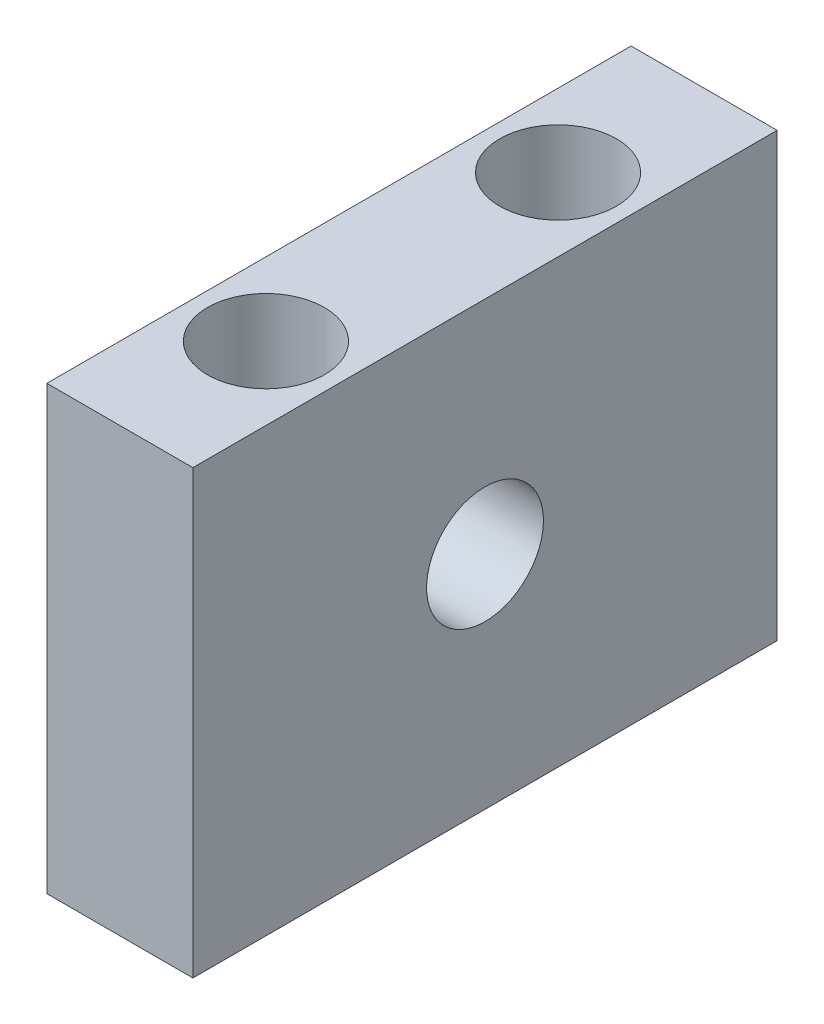
ISO-10303-21;
HEADER;
FILE_DESCRIPTION(('STEP AP214'),'2;1');
FILE_NAME('part.step','',(''),(''),'','','');
FILE_SCHEMA(('AUTOMOTIVE_DESIGN { 1 0 10303 214 1 1 1 1 }'));
ENDSEC;
DATA;
#1=APPLICATION_CONTEXT('core data for automotive mechanical design processes');
#2=APPLICATION_PROTOCOL_DEFINITION('international standard','automotive_design',2000,#1);
#3=PRODUCT_CONTEXT('',#1,'mechanical');
#4=PRODUCT('Part','Part','',(#3));
#5=PRODUCT_RELATED_PRODUCT_CATEGORY('part','',(#4));
#6=PRODUCT_DEFINITION_FORMATION('','',#4);
#7=PRODUCT_DEFINITION_CONTEXT('part definition',#1,'design');
#8=PRODUCT_DEFINITION('design','',#6,#7);
#9=PRODUCT_DEFINITION_SHAPE('','',#8);
#10=(LENGTH_UNIT() NAMED_UNIT(*) SI_UNIT(.MILLI.,.METRE.));
#11=(NAMED_UNIT(*) PLANE_ANGLE_UNIT() SI_UNIT($,.RADIAN.));
#12=(NAMED_UNIT(*) SI_UNIT($,.STERADIAN.) SOLID_ANGLE_UNIT());
#13=UNCERTAINTY_MEASURE_WITH_UNIT(LENGTH_MEASURE(1.E-05),#10,'distance_accuracy_value','');
#14=(GEOMETRIC_REPRESENTATION_CONTEXT(3) GLOBAL_UNCERTAINTY_ASSIGNED_CONTEXT((#13)) GLOBAL_UNIT_ASSIGNED_CONTEXT((#10,
#11,#12)) REPRESENTATION_CONTEXT('',''));
#15=CARTESIAN_POINT('',(0.,0.,0.));
#16=DIRECTION('',(0.,0.,1.));
#17=DIRECTION('',(1.,0.,0.));
#18=AXIS2_PLACEMENT_3D('',#15,#16,#17);
#19=CARTESIAN_POINT('',(5.,30.26,-20.));
#20=DIRECTION('',(-1.,0.,0.));
#21=DIRECTION('',(0.,0.,1.));
#22=AXIS2_PLACEMENT_3D('',#19,#20,#21);
#23=PLANE('',#22);
#24=CARTESIAN_POINT('',(5.,15.13,0.));
#25=DIRECTION('',(-1.,0.,0.));
#26=DIRECTION('',(0.,0.,1.));
#27=AXIS2_PLACEMENT_3D('',#24,#25,#26);
#28=CIRCLE('',#27,4.);
#29=CARTESIAN_POINT('',(5.,15.13,-4.));
#30=VERTEX_POINT('',#29);
#31=EDGE_CURVE('E135',#30,#30,#28,.T.);
#32=ORIENTED_EDGE('',*,*,#31,.T.);
#33=EDGE_LOOP('',(#32));
#34=FACE_BOUND('',#33,.T.);
#35=DIRECTION('',(0.,0.,-1.));
#36=VECTOR('',#35,1.);
#37=CARTESIAN_POINT('',(5.,0.,-20.));
#38=LINE('',#37,#36);
#39=CARTESIAN_POINT('',(5.,0.,20.));
#40=VERTEX_POINT('',#39);
#41=CARTESIAN_POINT('',(5.,0.,-20.));
#42=VERTEX_POINT('',#41);
#43=EDGE_CURVE('E109',#40,#42,#38,.T.);
#44=ORIENTED_EDGE('',*,*,#43,.T.);
#45=DIRECTION('',(0.,-1.,0.));
#46=VECTOR('',#45,1.);
#47=CARTESIAN_POINT('',(5.,30.26,-20.));
#48=LINE('',#47,#46);
#49=CARTESIAN_POINT('',(5.,30.26,-20.));
#50=VERTEX_POINT('',#49);
#51=EDGE_CURVE('E11',#50,#42,#48,.T.);
#52=ORIENTED_EDGE('',*,*,#51,.F.);
#53=DIRECTION('',(0.,0.,-1.));
#54=VECTOR('',#53,1.);
#55=CARTESIAN_POINT('',(5.,30.26,-20.));
#56=LINE('',#55,#54);
#57=CARTESIAN_POINT('',(5.,30.26,20.));
#58=VERTEX_POINT('',#57);
#59=EDGE_CURVE('E92',#58,#50,#56,.T.);
#60=ORIENTED_EDGE('',*,*,#59,.F.);
#61=DIRECTION('',(0.,-1.,0.));
#62=VECTOR('',#61,1.);
#63=CARTESIAN_POINT('',(5.,30.26,20.));
#64=LINE('',#63,#62);
#65=EDGE_CURVE('E105',#58,#40,#64,.T.);
#66=ORIENTED_EDGE('',*,*,#65,.T.);
#67=EDGE_LOOP('',(#44,#52,#60,#66));
#68=FACE_BOUND('',#67,.T.);
#69=ADVANCED_FACE('F39',(#34,#68),#23,.F.);
#70=CARTESIAN_POINT('',(-5.,30.26,-20.));
#71=DIRECTION('',(0.,0.,1.));
#72=DIRECTION('',(1.,0.,0.));
#73=AXIS2_PLACEMENT_3D('',#70,#71,#72);
#74=PLANE('',#73);
#75=DIRECTION('',(-1.,0.,0.));
#76=VECTOR('',#75,1.);
#77=CARTESIAN_POINT('',(-5.,0.,-20.));
#78=LINE('',#77,#76);
#79=CARTESIAN_POINT('',(-5.,0.,-20.));
#80=VERTEX_POINT('',#79);
#81=EDGE_CURVE('E97',#42,#80,#78,.T.);
#82=ORIENTED_EDGE('',*,*,#81,.T.);
#83=DIRECTION('',(0.,-1.,0.));
#84=VECTOR('',#83,1.);
#85=CARTESIAN_POINT('',(-5.,30.26,-20.));
#86=LINE('',#85,#84);
#87=CARTESIAN_POINT('',(-5.,30.26,-20.));
#88=VERTEX_POINT('',#87);
#89=EDGE_CURVE('E49',#88,#80,#86,.T.);
#90=ORIENTED_EDGE('',*,*,#89,.F.);
#91=DIRECTION('',(-1.,0.,0.));
#92=VECTOR('',#91,1.);
#93=CARTESIAN_POINT('',(-5.,30.26,-20.));
#94=LINE('',#93,#92);
#95=EDGE_CURVE('E87',#50,#88,#94,.T.);
#96=ORIENTED_EDGE('',*,*,#95,.F.);
#97=ORIENTED_EDGE('',*,*,#51,.T.);
#98=EDGE_LOOP('',(#82,#90,#96,#97));
#99=FACE_BOUND('',#98,.T.);
#100=ADVANCED_FACE('F96',(#99),#74,.F.);
#101=CARTESIAN_POINT('',(-5.,30.26,-20.));
#102=DIRECTION('',(1.,0.,0.));
#103=DIRECTION('',(0.,0.,-1.));
#104=AXIS2_PLACEMENT_3D('',#101,#102,#103);
#105=PLANE('',#104);
#106=CARTESIAN_POINT('',(-5.,15.13,0.));
#107=DIRECTION('',(1.,0.,0.));
#108=DIRECTION('',(0.,0.,-1.));
#109=AXIS2_PLACEMENT_3D('',#106,#107,#108);
#110=CIRCLE('',#109,4.);
#111=CARTESIAN_POINT('',(-5.,15.13,-4.));
#112=VERTEX_POINT('',#111);
#113=EDGE_CURVE('E42',#112,#112,#110,.T.);
#114=ORIENTED_EDGE('',*,*,#113,.T.);
#115=EDGE_LOOP('',(#114));
#116=FACE_BOUND('',#115,.T.);
#117=DIRECTION('',(0.,0.,1.));
#118=VECTOR('',#117,1.);
#119=CARTESIAN_POINT('',(-5.,0.,-20.));
#120=LINE('',#119,#118);
#121=CARTESIAN_POINT('',(-5.,0.,20.));
#122=VERTEX_POINT('',#121);
#123=EDGE_CURVE('E74',#80,#122,#120,.T.);
#124=ORIENTED_EDGE('',*,*,#123,.T.);
#125=DIRECTION('',(0.,-1.,0.));
#126=VECTOR('',#125,1.);
#127=CARTESIAN_POINT('',(-5.,30.26,20.));
#128=LINE('',#127,#126);
#129=CARTESIAN_POINT('',(-5.,30.26,20.));
#130=VERTEX_POINT('',#129);
#131=EDGE_CURVE('E99',#130,#122,#128,.T.);
#132=ORIENTED_EDGE('',*,*,#131,.F.);
#133=DIRECTION('',(0.,0.,1.));
#134=VECTOR('',#133,1.);
#135=CARTESIAN_POINT('',(-5.,30.26,-20.));
#136=LINE('',#135,#134);
#137=EDGE_CURVE('E90',#88,#130,#136,.T.);
#138=ORIENTED_EDGE('',*,*,#137,.F.);
#139=ORIENTED_EDGE('',*,*,#89,.T.);
#140=EDGE_LOOP('',(#124,#132,#138,#139));
#141=FACE_BOUND('',#140,.T.);
#142=ADVANCED_FACE('F101',(#116,#141),#105,.F.);
#143=CARTESIAN_POINT('',(-5.,30.26,20.));
#144=DIRECTION('',(0.,0.,-1.));
#145=DIRECTION('',(-1.,0.,0.));
#146=AXIS2_PLACEMENT_3D('',#143,#144,#145);
#147=PLANE('',#146);
#148=DIRECTION('',(1.,0.,0.));
#149=VECTOR('',#148,1.);
#150=CARTESIAN_POINT('',(-5.,0.,20.));
#151=LINE('',#150,#149);
#152=EDGE_CURVE('E80',#122,#40,#151,.T.);
#153=ORIENTED_EDGE('',*,*,#152,.T.);
#154=ORIENTED_EDGE('',*,*,#65,.F.);
#155=DIRECTION('',(1.,0.,0.));
#156=VECTOR('',#155,1.);
#157=CARTESIAN_POINT('',(-5.,30.26,20.));
#158=LINE('',#157,#156);
#159=EDGE_CURVE('E57',#130,#58,#158,.T.);
#160=ORIENTED_EDGE('',*,*,#159,.F.);
#161=ORIENTED_EDGE('',*,*,#131,.T.);
#162=EDGE_LOOP('',(#153,#154,#160,#161));
#163=FACE_BOUND('',#162,.T.);
#164=ADVANCED_FACE('F123',(#163),#147,.F.);
#165=CARTESIAN_POINT('',(0.,30.26,0.));
#166=DIRECTION('',(0.,1.,0.));
#167=DIRECTION('',(0.,0.,1.));
#168=AXIS2_PLACEMENT_3D('',#165,#166,#167);
#169=PLANE('',#168);
#170=CARTESIAN_POINT('',(0.,30.26,10.));
#171=DIRECTION('',(0.,1.,0.));
#172=DIRECTION('',(0.,0.,1.));
#173=AXIS2_PLACEMENT_3D('',#170,#171,#172);
#174=CIRCLE('',#173,4.);
#175=CARTESIAN_POINT('',(0.,30.26,6.));
#176=VERTEX_POINT('',#175);
#177=EDGE_CURVE('E113',#176,#176,#174,.T.);
#178=ORIENTED_EDGE('',*,*,#177,.F.);
#179=EDGE_LOOP('',(#178));
#180=FACE_BOUND('',#179,.T.);
#181=CARTESIAN_POINT('',(0.,30.26,-10.));
#182=DIRECTION('',(0.,1.,0.));
#183=DIRECTION('',(0.,0.,1.));
#184=AXIS2_PLACEMENT_3D('',#181,#182,#183);
#185=CIRCLE('',#184,4.);
#186=CARTESIAN_POINT('',(0.,30.26,-14.));
#187=VERTEX_POINT('',#186);
#188=EDGE_CURVE('E134',#187,#187,#185,.T.);
#189=ORIENTED_EDGE('',*,*,#188,.F.);
#190=EDGE_LOOP('',(#189));
#191=FACE_BOUND('',#190,.T.);
#192=ORIENTED_EDGE('',*,*,#59,.T.);
#193=ORIENTED_EDGE('',*,*,#95,.T.);
#194=ORIENTED_EDGE('',*,*,#137,.T.);
#195=ORIENTED_EDGE('',*,*,#159,.T.);
#196=EDGE_LOOP('',(#192,#193,#194,#195));
#197=FACE_BOUND('',#196,.T.);
#198=ADVANCED_FACE('F88',(#180,#191,#197),#169,.T.);
#199=CARTESIAN_POINT('',(0.,0.,0.));
#200=DIRECTION('',(0.,1.,0.));
#201=DIRECTION('',(0.,0.,1.));
#202=AXIS2_PLACEMENT_3D('',#199,#200,#201);
#203=PLANE('',#202);
#204=CARTESIAN_POINT('',(0.,0.,10.));
#205=DIRECTION('',(0.,1.,0.));
#206=DIRECTION('',(0.,0.,1.));
#207=AXIS2_PLACEMENT_3D('',#204,#205,#206);
#208=CIRCLE('',#207,4.);
#209=CARTESIAN_POINT('',(0.,0.,6.));
#210=VERTEX_POINT('',#209);
#211=EDGE_CURVE('E139',#210,#210,#208,.T.);
#212=ORIENTED_EDGE('',*,*,#211,.T.);
#213=EDGE_LOOP('',(#212));
#214=FACE_BOUND('',#213,.T.);
#215=CARTESIAN_POINT('',(0.,0.,-10.));
#216=DIRECTION('',(0.,1.,0.));
#217=DIRECTION('',(0.,0.,1.));
#218=AXIS2_PLACEMENT_3D('',#215,#216,#217);
#219=CIRCLE('',#218,4.);
#220=CARTESIAN_POINT('',(0.,0.,-14.));
#221=VERTEX_POINT('',#220);
#222=EDGE_CURVE('E130',#221,#221,#219,.T.);
#223=ORIENTED_EDGE('',*,*,#222,.T.);
#224=EDGE_LOOP('',(#223));
#225=FACE_BOUND('',#224,.T.);
#226=ORIENTED_EDGE('',*,*,#43,.F.);
#227=ORIENTED_EDGE('',*,*,#152,.F.);
#228=ORIENTED_EDGE('',*,*,#123,.F.);
#229=ORIENTED_EDGE('',*,*,#81,.F.);
#230=EDGE_LOOP('',(#226,#227,#228,#229));
#231=FACE_BOUND('',#230,.T.);
#232=ADVANCED_FACE('F126',(#214,#225,#231),#203,.F.);
#233=CARTESIAN_POINT('',(0.,30.26,-10.));
#234=DIRECTION('',(0.,-1.,0.));
#235=DIRECTION('',(0.,0.,-1.));
#236=AXIS2_PLACEMENT_3D('',#233,#234,#235);
#237=CYLINDRICAL_SURFACE('',#236,4.);
#238=CARTESIAN_POINT('',(0.,30.26,-14.));
#239=CARTESIAN_POINT('',(0.,29.9447916666667,-14.));
#240=CARTESIAN_POINT('',(0.,29.6295833333333,-14.));
#241=CARTESIAN_POINT('',(0.,28.9991666666667,-14.));
#242=CARTESIAN_POINT('',(0.,28.6839583333333,-14.));
#243=CARTESIAN_POINT('',(0.,28.0535416666667,-14.));
#244=CARTESIAN_POINT('',(0.,27.7383333333333,-14.));
#245=CARTESIAN_POINT('',(0.,27.1079166666667,-14.));
#246=CARTESIAN_POINT('',(0.,26.7927083333333,-14.));
#247=CARTESIAN_POINT('',(0.,26.1622916666667,-14.));
#248=CARTESIAN_POINT('',(0.,25.8470833333333,-14.));
#249=CARTESIAN_POINT('',(0.,25.2166666666667,-14.));
#250=CARTESIAN_POINT('',(0.,24.9014583333333,-14.));
#251=CARTESIAN_POINT('',(0.,24.2710416666667,-14.));
#252=CARTESIAN_POINT('',(0.,23.9558333333333,-14.));
#253=CARTESIAN_POINT('',(0.,23.3254166666667,-14.));
#254=CARTESIAN_POINT('',(0.,23.0102083333333,-14.));
#255=CARTESIAN_POINT('',(0.,22.3797916666667,-14.));
#256=CARTESIAN_POINT('',(0.,22.0645833333333,-14.));
#257=CARTESIAN_POINT('',(0.,21.4341666666667,-14.));
#258=CARTESIAN_POINT('',(0.,21.1189583333333,-14.));
#259=CARTESIAN_POINT('',(0.,20.4885416666667,-14.));
#260=CARTESIAN_POINT('',(0.,20.1733333333333,-14.));
#261=CARTESIAN_POINT('',(0.,19.5429166666667,-14.));
#262=CARTESIAN_POINT('',(0.,19.2277083333333,-14.));
#263=CARTESIAN_POINT('',(0.,18.5972916666667,-14.));
#264=CARTESIAN_POINT('',(0.,18.2820833333333,-14.));
#265=CARTESIAN_POINT('',(0.,17.6516666666667,-14.));
#266=CARTESIAN_POINT('',(0.,17.3364583333333,-14.));
#267=CARTESIAN_POINT('',(0.,16.7060416666667,-14.));
#268=CARTESIAN_POINT('',(0.,16.3908333333333,-14.));
#269=CARTESIAN_POINT('',(0.,15.7604166666667,-14.));
#270=CARTESIAN_POINT('',(0.,15.4452083333333,-14.));
#271=CARTESIAN_POINT('',(0.,14.8147916666667,-14.));
#272=CARTESIAN_POINT('',(0.,14.4995833333333,-14.));
#273=CARTESIAN_POINT('',(0.,13.8691666666667,-14.));
#274=CARTESIAN_POINT('',(0.,13.5539583333333,-14.));
#275=CARTESIAN_POINT('',(0.,12.9235416666667,-14.));
#276=CARTESIAN_POINT('',(0.,12.6083333333333,-14.));
#277=CARTESIAN_POINT('',(0.,11.9779166666667,-14.));
#278=CARTESIAN_POINT('',(0.,11.6627083333333,-14.));
#279=CARTESIAN_POINT('',(0.,11.0322916666667,-14.));
#280=CARTESIAN_POINT('',(0.,10.7170833333333,-14.));
#281=CARTESIAN_POINT('',(0.,10.0866666666667,-14.));
#282=CARTESIAN_POINT('',(0.,9.77145833333333,-14.));
#283=CARTESIAN_POINT('',(0.,9.14104166666666,-14.));
#284=CARTESIAN_POINT('',(0.,8.82583333333333,-14.));
#285=CARTESIAN_POINT('',(0.,8.19541666666666,-14.));
#286=CARTESIAN_POINT('',(0.,7.88020833333333,-14.));
#287=CARTESIAN_POINT('',(0.,7.24979166666667,-14.));
#288=CARTESIAN_POINT('',(0.,6.93458333333333,-14.));
#289=CARTESIAN_POINT('',(0.,6.30416666666666,-14.));
#290=CARTESIAN_POINT('',(0.,5.98895833333333,-14.));
#291=CARTESIAN_POINT('',(0.,5.35854166666666,-14.));
#292=CARTESIAN_POINT('',(0.,5.04333333333333,-14.));
#293=CARTESIAN_POINT('',(0.,4.41291666666666,-14.));
#294=CARTESIAN_POINT('',(0.,4.09770833333333,-14.));
#295=CARTESIAN_POINT('',(0.,3.46729166666666,-14.));
#296=CARTESIAN_POINT('',(0.,3.15208333333333,-14.));
#297=CARTESIAN_POINT('',(0.,2.52166666666666,-14.));
#298=CARTESIAN_POINT('',(0.,2.20645833333333,-14.));
#299=CARTESIAN_POINT('',(0.,1.57604166666666,-14.));
#300=CARTESIAN_POINT('',(0.,1.26083333333333,-14.));
#301=CARTESIAN_POINT('',(0.,0.630416666666662,-14.));
#302=CARTESIAN_POINT('',(0.,0.315208333333329,-14.));
#303=CARTESIAN_POINT('',(0.,0.,-14.));
#304=B_SPLINE_CURVE_WITH_KNOTS('',3,(#238,#239,#240,#241,#242,#243,#244,#245,#246,#247,#248,
#249,#250,#251,#252,#253,#254,#255,#256,#257,#258,#259,#260,#261,#262,#263,#264,#265,#266,#267,
#268,#269,#270,#271,#272,#273,#274,#275,#276,#277,#278,#279,#280,#281,#282,#283,#284,#285,#286,
#287,#288,#289,#290,#291,#292,#293,#294,#295,#296,#297,#298,#299,#300,#301,#302,#303),
.UNSPECIFIED.,.F.,.F.,(4,2,2,2,2,2,2,2,2,2,2,2,2,2,2,2,2,2,2,2,2,2,2,2,2,2,2,2,2,2,2,2,4),(0.,
0.945624999999999,1.89125,2.836875,3.7825,4.728125,5.67375,6.619375,7.565,8.510625,9.45625,
10.401875,11.3475,12.293125,13.23875,14.184375,15.13,16.075625,17.02125,17.966875,18.9125,
19.858125,20.80375,21.749375,22.695,23.640625,24.58625,25.531875,26.4775,27.423125,28.36875,
29.314375,30.26),.UNSPECIFIED.);
#305=EDGE_CURVE('BSEAM163',#187,#221,#304,.T.);
#306=ORIENTED_EDGE('',*,*,#188,.T.);
#307=ORIENTED_EDGE('',*,*,#222,.F.);
#308=ORIENTED_EDGE('',*,*,#305,.T.);
#309=ORIENTED_EDGE('',*,*,#305,.F.);
#310=EDGE_LOOP('',(#306,#308,#307,#309));
#311=FACE_BOUND('',#310,.T.);
#312=ADVANCED_FACE('F163',(#311),#237,.F.);
#313=CARTESIAN_POINT('',(0.,30.26,10.));
#314=DIRECTION('',(0.,-1.,0.));
#315=DIRECTION('',(0.,0.,-1.));
#316=AXIS2_PLACEMENT_3D('',#313,#314,#315);
#317=CYLINDRICAL_SURFACE('',#316,4.);
#318=CARTESIAN_POINT('',(0.,30.26,6.));
#319=CARTESIAN_POINT('',(0.,29.9447916666667,6.));
#320=CARTESIAN_POINT('',(0.,29.6295833333333,6.));
#321=CARTESIAN_POINT('',(0.,28.9991666666667,6.));
#322=CARTESIAN_POINT('',(0.,28.6839583333333,6.));
#323=CARTESIAN_POINT('',(0.,28.0535416666667,6.));
#324=CARTESIAN_POINT('',(0.,27.7383333333333,6.));
#325=CARTESIAN_POINT('',(0.,27.1079166666667,6.));
#326=CARTESIAN_POINT('',(0.,26.7927083333333,6.));
#327=CARTESIAN_POINT('',(0.,26.1622916666667,6.));
#328=CARTESIAN_POINT('',(0.,25.8470833333333,6.));
#329=CARTESIAN_POINT('',(0.,25.2166666666667,6.));
#330=CARTESIAN_POINT('',(0.,24.9014583333333,6.));
#331=CARTESIAN_POINT('',(0.,24.2710416666667,6.));
#332=CARTESIAN_POINT('',(0.,23.9558333333333,6.));
#333=CARTESIAN_POINT('',(0.,23.3254166666667,6.));
#334=CARTESIAN_POINT('',(0.,23.0102083333333,6.));
#335=CARTESIAN_POINT('',(0.,22.3797916666667,6.));
#336=CARTESIAN_POINT('',(0.,22.0645833333333,6.));
#337=CARTESIAN_POINT('',(0.,21.4341666666667,6.));
#338=CARTESIAN_POINT('',(0.,21.1189583333333,6.));
#339=CARTESIAN_POINT('',(0.,20.4885416666667,6.));
#340=CARTESIAN_POINT('',(0.,20.1733333333333,6.));
#341=CARTESIAN_POINT('',(0.,19.5429166666667,6.));
#342=CARTESIAN_POINT('',(0.,19.2277083333333,6.));
#343=CARTESIAN_POINT('',(0.,18.5972916666667,6.));
#344=CARTESIAN_POINT('',(0.,18.2820833333333,6.));
#345=CARTESIAN_POINT('',(0.,17.6516666666667,6.));
#346=CARTESIAN_POINT('',(0.,17.3364583333333,6.));
#347=CARTESIAN_POINT('',(0.,16.7060416666667,6.));
#348=CARTESIAN_POINT('',(0.,16.3908333333333,6.));
#349=CARTESIAN_POINT('',(0.,15.7604166666667,6.));
#350=CARTESIAN_POINT('',(0.,15.4452083333333,6.));
#351=CARTESIAN_POINT('',(0.,14.8147916666667,6.));
#352=CARTESIAN_POINT('',(0.,14.4995833333333,6.));
#353=CARTESIAN_POINT('',(0.,13.8691666666667,6.));
#354=CARTESIAN_POINT('',(0.,13.5539583333333,6.));
#355=CARTESIAN_POINT('',(0.,12.9235416666667,6.));
#356=CARTESIAN_POINT('',(0.,12.6083333333333,6.));
#357=CARTESIAN_POINT('',(0.,11.9779166666667,6.));
#358=CARTESIAN_POINT('',(0.,11.6627083333333,6.));
#359=CARTESIAN_POINT('',(0.,11.0322916666667,6.));
#360=CARTESIAN_POINT('',(0.,10.7170833333333,6.));
#361=CARTESIAN_POINT('',(0.,10.0866666666667,6.));
#362=CARTESIAN_POINT('',(0.,9.77145833333333,6.));
#363=CARTESIAN_POINT('',(0.,9.14104166666666,6.));
#364=CARTESIAN_POINT('',(0.,8.82583333333333,6.));
#365=CARTESIAN_POINT('',(0.,8.19541666666666,6.));
#366=CARTESIAN_POINT('',(0.,7.88020833333333,6.));
#367=CARTESIAN_POINT('',(0.,7.24979166666667,6.));
#368=CARTESIAN_POINT('',(0.,6.93458333333333,6.));
#369=CARTESIAN_POINT('',(0.,6.30416666666666,6.));
#370=CARTESIAN_POINT('',(0.,5.98895833333333,6.));
#371=CARTESIAN_POINT('',(0.,5.35854166666666,6.));
#372=CARTESIAN_POINT('',(0.,5.04333333333333,6.));
#373=CARTESIAN_POINT('',(0.,4.41291666666666,6.));
#374=CARTESIAN_POINT('',(0.,4.09770833333333,6.));
#375=CARTESIAN_POINT('',(0.,3.46729166666666,6.));
#376=CARTESIAN_POINT('',(0.,3.15208333333333,6.));
#377=CARTESIAN_POINT('',(0.,2.52166666666666,6.));
#378=CARTESIAN_POINT('',(0.,2.20645833333333,6.));
#379=CARTESIAN_POINT('',(0.,1.57604166666666,6.));
#380=CARTESIAN_POINT('',(0.,1.26083333333333,6.));
#381=CARTESIAN_POINT('',(0.,0.630416666666662,6.));
#382=CARTESIAN_POINT('',(0.,0.315208333333329,6.));
#383=CARTESIAN_POINT('',(0.,0.,6.));
#384=B_SPLINE_CURVE_WITH_KNOTS('',3,(#318,#319,#320,#321,#322,#323,#324,#325,#326,#327,#328,
#329,#330,#331,#332,#333,#334,#335,#336,#337,#338,#339,#340,#341,#342,#343,#344,#345,#346,#347,
#348,#349,#350,#351,#352,#353,#354,#355,#356,#357,#358,#359,#360,#361,#362,#363,#364,#365,#366,
#367,#368,#369,#370,#371,#372,#373,#374,#375,#376,#377,#378,#379,#380,#381,#382,#383),
.UNSPECIFIED.,.F.,.F.,(4,2,2,2,2,2,2,2,2,2,2,2,2,2,2,2,2,2,2,2,2,2,2,2,2,2,2,2,2,2,2,2,4),(0.,
0.945624999999999,1.89125,2.836875,3.7825,4.728125,5.67375,6.619375,7.565,8.510625,9.45625,
10.401875,11.3475,12.293125,13.23875,14.184375,15.13,16.075625,17.02125,17.966875,18.9125,
19.858125,20.80375,21.749375,22.695,23.640625,24.58625,25.531875,26.4775,27.423125,28.36875,
29.314375,30.26),.UNSPECIFIED.);
#385=EDGE_CURVE('BSEAM158',#176,#210,#384,.T.);
#386=ORIENTED_EDGE('',*,*,#177,.T.);
#387=ORIENTED_EDGE('',*,*,#211,.F.);
#388=ORIENTED_EDGE('',*,*,#385,.T.);
#389=ORIENTED_EDGE('',*,*,#385,.F.);
#390=EDGE_LOOP('',(#386,#388,#387,#389));
#391=FACE_BOUND('',#390,.T.);
#392=ADVANCED_FACE('F158',(#391),#317,.F.);
#393=CARTESIAN_POINT('',(-15.13,15.13,0.));
#394=DIRECTION('',(1.,0.,0.));
#395=DIRECTION('',(0.,0.,-1.));
#396=AXIS2_PLACEMENT_3D('',#393,#394,#395);
#397=CYLINDRICAL_SURFACE('',#396,4.);
#398=CARTESIAN_POINT('',(-5.,15.13,-4.));
#399=CARTESIAN_POINT('',(-4.89583333333333,15.13,-4.));
#400=CARTESIAN_POINT('',(-4.79166666666667,15.13,-4.));
#401=CARTESIAN_POINT('',(-4.58333333333333,15.13,-4.));
#402=CARTESIAN_POINT('',(-4.47916666666667,15.13,-4.));
#403=CARTESIAN_POINT('',(-4.27083333333333,15.13,-4.));
#404=CARTESIAN_POINT('',(-4.16666666666667,15.13,-4.));
#405=CARTESIAN_POINT('',(-3.95833333333333,15.13,-4.));
#406=CARTESIAN_POINT('',(-3.85416666666667,15.13,-4.));
#407=CARTESIAN_POINT('',(-3.64583333333333,15.13,-4.));
#408=CARTESIAN_POINT('',(-3.54166666666667,15.13,-4.));
#409=CARTESIAN_POINT('',(-3.33333333333333,15.13,-4.));
#410=CARTESIAN_POINT('',(-3.22916666666667,15.13,-4.));
#411=CARTESIAN_POINT('',(-3.02083333333333,15.13,-4.));
#412=CARTESIAN_POINT('',(-2.91666666666667,15.13,-4.));
#413=CARTESIAN_POINT('',(-2.70833333333333,15.13,-4.));
#414=CARTESIAN_POINT('',(-2.60416666666667,15.13,-4.));
#415=CARTESIAN_POINT('',(-2.39583333333333,15.13,-4.));
#416=CARTESIAN_POINT('',(-2.29166666666667,15.13,-4.));
#417=CARTESIAN_POINT('',(-2.08333333333333,15.13,-4.));
#418=CARTESIAN_POINT('',(-1.97916666666667,15.13,-4.));
#419=CARTESIAN_POINT('',(-1.77083333333333,15.13,-4.));
#420=CARTESIAN_POINT('',(-1.66666666666667,15.13,-4.));
#421=CARTESIAN_POINT('',(-1.45833333333333,15.13,-4.));
#422=CARTESIAN_POINT('',(-1.35416666666667,15.13,-4.));
#423=CARTESIAN_POINT('',(-1.14583333333333,15.13,-4.));
#424=CARTESIAN_POINT('',(-1.04166666666667,15.13,-4.));
#425=CARTESIAN_POINT('',(-0.833333333333332,15.13,-4.));
#426=CARTESIAN_POINT('',(-0.729166666666666,15.13,-4.));
#427=CARTESIAN_POINT('',(-0.520833333333333,15.13,-4.));
#428=CARTESIAN_POINT('',(-0.416666666666666,15.13,-4.));
#429=CARTESIAN_POINT('',(-0.208333333333334,15.13,-4.));
#430=CARTESIAN_POINT('',(-0.104166666666667,15.13,-4.));
#431=CARTESIAN_POINT('',(0.104166666666667,15.13,-4.));
#432=CARTESIAN_POINT('',(0.208333333333334,15.13,-4.));
#433=CARTESIAN_POINT('',(0.416666666666666,15.13,-4.));
#434=CARTESIAN_POINT('',(0.520833333333331,15.13,-4.));
#435=CARTESIAN_POINT('',(0.729166666666664,15.13,-4.));
#436=CARTESIAN_POINT('',(0.833333333333331,15.13,-4.));
#437=CARTESIAN_POINT('',(1.04166666666666,15.13,-4.));
#438=CARTESIAN_POINT('',(1.14583333333333,15.13,-4.));
#439=CARTESIAN_POINT('',(1.35416666666666,15.13,-4.));
#440=CARTESIAN_POINT('',(1.45833333333333,15.13,-4.));
#441=CARTESIAN_POINT('',(1.66666666666666,15.13,-4.));
#442=CARTESIAN_POINT('',(1.77083333333333,15.13,-4.));
#443=CARTESIAN_POINT('',(1.97916666666667,15.13,-4.));
#444=CARTESIAN_POINT('',(2.08333333333333,15.13,-4.));
#445=CARTESIAN_POINT('',(2.29166666666667,15.13,-4.));
#446=CARTESIAN_POINT('',(2.39583333333333,15.13,-4.));
#447=CARTESIAN_POINT('',(2.60416666666667,15.13,-4.));
#448=CARTESIAN_POINT('',(2.70833333333333,15.13,-4.));
#449=CARTESIAN_POINT('',(2.91666666666666,15.13,-4.));
#450=CARTESIAN_POINT('',(3.02083333333333,15.13,-4.));
#451=CARTESIAN_POINT('',(3.22916666666666,15.13,-4.));
#452=CARTESIAN_POINT('',(3.33333333333333,15.13,-4.));
#453=CARTESIAN_POINT('',(3.54166666666666,15.13,-4.));
#454=CARTESIAN_POINT('',(3.64583333333333,15.13,-4.));
#455=CARTESIAN_POINT('',(3.85416666666666,15.13,-4.));
#456=CARTESIAN_POINT('',(3.95833333333333,15.13,-4.));
#457=CARTESIAN_POINT('',(4.16666666666666,15.13,-4.));
#458=CARTESIAN_POINT('',(4.27083333333333,15.13,-4.));
#459=CARTESIAN_POINT('',(4.47916666666666,15.13,-4.));
#460=CARTESIAN_POINT('',(4.58333333333333,15.13,-4.));
#461=CARTESIAN_POINT('',(4.79166666666666,15.13,-4.));
#462=CARTESIAN_POINT('',(4.89583333333333,15.13,-4.));
#463=CARTESIAN_POINT('',(5.,15.13,-4.));
#464=B_SPLINE_CURVE_WITH_KNOTS('',3,(#398,#399,#400,#401,#402,#403,#404,#405,#406,#407,#408,
#409,#410,#411,#412,#413,#414,#415,#416,#417,#418,#419,#420,#421,#422,#423,#424,#425,#426,#427,
#428,#429,#430,#431,#432,#433,#434,#435,#436,#437,#438,#439,#440,#441,#442,#443,#444,#445,#446,
#447,#448,#449,#450,#451,#452,#453,#454,#455,#456,#457,#458,#459,#460,#461,#462,#463),
.UNSPECIFIED.,.F.,.F.,(4,2,2,2,2,2,2,2,2,2,2,2,2,2,2,2,2,2,2,2,2,2,2,2,2,2,2,2,2,2,2,2,4),(0.,
0.3125,0.625000000000001,0.937499999999999,1.25,1.5625,1.875,2.1875,2.5,2.8125,3.125,3.4375,
3.75,4.0625,4.375,4.6875,5.,5.3125,5.625,5.9375,6.25,6.5625,6.875,7.1875,7.5,7.8125,
8.12499999999999,8.43749999999999,8.75,9.0625,9.375,9.6875,10.),.UNSPECIFIED.);
#465=EDGE_CURVE('BSEAM155',#112,#30,#464,.T.);
#466=ORIENTED_EDGE('',*,*,#113,.F.);
#467=ORIENTED_EDGE('',*,*,#31,.F.);
#468=ORIENTED_EDGE('',*,*,#465,.T.);
#469=ORIENTED_EDGE('',*,*,#465,.F.);
#470=EDGE_LOOP('',(#466,#468,#467,#469));
#471=FACE_BOUND('',#470,.T.);
#472=ADVANCED_FACE('F155',(#471),#397,.F.);
#473=CLOSED_SHELL('',(#69,#100,#142,#164,#198,#232,#312,#392,#472));
#474=MANIFOLD_SOLID_BREP('B2',#473);
#475=ADVANCED_BREP_SHAPE_REPRESENTATION('',(#18,#474),#14);
#476=SHAPE_DEFINITION_REPRESENTATION(#9,#475);
ENDSEC;
END-ISO-10303-21;
